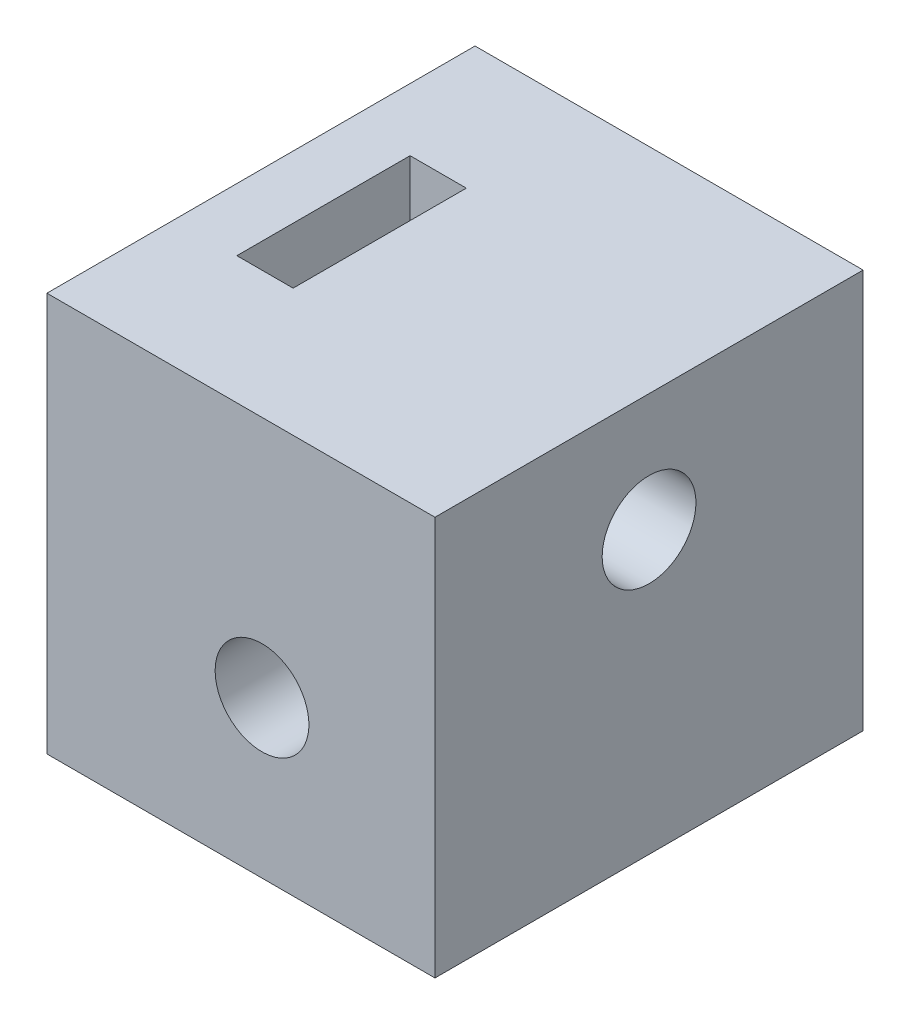
ISO-10303-21;
HEADER;
FILE_DESCRIPTION(('STEP AP214'),'2;1');
FILE_NAME('part.step','',(''),(''),'','','');
FILE_SCHEMA(('AUTOMOTIVE_DESIGN { 1 0 10303 214 1 1 1 1 }'));
ENDSEC;
DATA;
#1=APPLICATION_CONTEXT('core data for automotive mechanical design processes');
#2=APPLICATION_PROTOCOL_DEFINITION('international standard','automotive_design',2000,#1);
#3=PRODUCT_CONTEXT('',#1,'mechanical');
#4=PRODUCT('Part','Part','',(#3));
#5=PRODUCT_RELATED_PRODUCT_CATEGORY('part','',(#4));
#6=PRODUCT_DEFINITION_FORMATION('','',#4);
#7=PRODUCT_DEFINITION_CONTEXT('part definition',#1,'design');
#8=PRODUCT_DEFINITION('design','',#6,#7);
#9=PRODUCT_DEFINITION_SHAPE('','',#8);
#10=(LENGTH_UNIT() NAMED_UNIT(*) SI_UNIT(.MILLI.,.METRE.));
#11=(NAMED_UNIT(*) PLANE_ANGLE_UNIT() SI_UNIT($,.RADIAN.));
#12=(NAMED_UNIT(*) SI_UNIT($,.STERADIAN.) SOLID_ANGLE_UNIT());
#13=UNCERTAINTY_MEASURE_WITH_UNIT(LENGTH_MEASURE(1.E-05),#10,'distance_accuracy_value','');
#14=(GEOMETRIC_REPRESENTATION_CONTEXT(3) GLOBAL_UNCERTAINTY_ASSIGNED_CONTEXT((#13)) GLOBAL_UNIT_ASSIGNED_CONTEXT((#10,
#11,#12)) REPRESENTATION_CONTEXT('',''));
#15=CARTESIAN_POINT('',(0.,0.,0.));
#16=DIRECTION('',(0.,0.,1.));
#17=DIRECTION('',(1.,0.,0.));
#18=AXIS2_PLACEMENT_3D('',#15,#16,#17);
#19=CARTESIAN_POINT('',(7.00000000000103,8.99999999999991,6.85));
#20=DIRECTION('',(-1.,0.,0.));
#21=DIRECTION('',(0.,0.,1.));
#22=AXIS2_PLACEMENT_3D('',#19,#20,#21);
#23=CYLINDRICAL_SURFACE('',#22,1.5);
#24=CARTESIAN_POINT('',(-5.4176325201907,8.99999999999991,6.85));
#25=DIRECTION('',(-1.,0.,0.));
#26=DIRECTION('',(0.,0.,1.));
#27=AXIS2_PLACEMENT_3D('',#24,#25,#26);
#28=CIRCLE('',#27,1.5);
#29=CARTESIAN_POINT('',(-5.4176325201907,8.99999999999991,8.35));
#30=VERTEX_POINT('',#29);
#31=EDGE_CURVE('E201',#30,#30,#28,.T.);
#32=ORIENTED_EDGE('',*,*,#31,.T.);
#33=EDGE_LOOP('',(#32));
#34=FACE_BOUND('',#33,.T.);
#35=CARTESIAN_POINT('',(-3.4176325201907,8.99999999999991,6.85));
#36=DIRECTION('',(1.,0.,0.));
#37=DIRECTION('',(0.,1.,0.));
#38=AXIS2_PLACEMENT_3D('',#35,#36,#37);
#39=CIRCLE('',#38,1.5);
#40=CARTESIAN_POINT('',(-3.4176325201907,10.4999999999999,6.85));
#41=VERTEX_POINT('',#40);
#42=EDGE_CURVE('E196',#41,#41,#39,.F.);
#43=ORIENTED_EDGE('',*,*,#42,.F.);
#44=EDGE_LOOP('',(#43));
#45=FACE_BOUND('',#44,.T.);
#46=ADVANCED_FACE('F35',(#34,#45),#23,.F.);
#47=CARTESIAN_POINT('',(7.00000000000103,5.70584955722062E-13,13.7));
#48=DIRECTION('',(-1.,0.,0.));
#49=DIRECTION('',(0.,-1.,0.));
#50=AXIS2_PLACEMENT_3D('',#47,#48,#49);
#51=PLANE('',#50);
#52=CARTESIAN_POINT('',(7.00000000000103,8.99999999999991,6.85));
#53=DIRECTION('',(-1.,0.,0.));
#54=DIRECTION('',(0.,0.,1.));
#55=AXIS2_PLACEMENT_3D('',#52,#53,#54);
#56=CIRCLE('',#55,1.5);
#57=CARTESIAN_POINT('',(7.00000000000103,8.99999999999991,8.35));
#58=VERTEX_POINT('',#57);
#59=EDGE_CURVE('E197',#58,#58,#56,.T.);
#60=ORIENTED_EDGE('',*,*,#59,.T.);
#61=EDGE_LOOP('',(#60));
#62=FACE_BOUND('',#61,.T.);
#63=DIRECTION('',(0.,1.,0.));
#64=VECTOR('',#63,1.);
#65=CARTESIAN_POINT('',(7.00000000000103,5.70584955722062E-13,0.));
#66=LINE('',#65,#64);
#67=CARTESIAN_POINT('',(7.00000000000103,-8.20732370954123E-13,0.));
#68=VERTEX_POINT('',#67);
#69=CARTESIAN_POINT('',(6.99999999999999,12.7690688757875,0.));
#70=VERTEX_POINT('',#69);
#71=EDGE_CURVE('E220',#68,#70,#66,.T.);
#72=ORIENTED_EDGE('',*,*,#71,.T.);
#73=DIRECTION('',(0.,0.,-1.));
#74=VECTOR('',#73,1.);
#75=CARTESIAN_POINT('',(6.99999999999999,12.7690688757875,13.7));
#76=LINE('',#75,#74);
#77=CARTESIAN_POINT('',(6.99999999999999,12.7690688757875,13.7));
#78=VERTEX_POINT('',#77);
#79=EDGE_CURVE('E11',#78,#70,#76,.T.);
#80=ORIENTED_EDGE('',*,*,#79,.F.);
#81=DIRECTION('',(0.,1.,0.));
#82=VECTOR('',#81,1.);
#83=CARTESIAN_POINT('',(7.00000000000103,5.70584955722062E-13,13.7));
#84=LINE('',#83,#82);
#85=CARTESIAN_POINT('',(7.00000000000103,-8.20732370954123E-13,13.7));
#86=VERTEX_POINT('',#85);
#87=EDGE_CURVE('E207',#86,#78,#84,.T.);
#88=ORIENTED_EDGE('',*,*,#87,.F.);
#89=DIRECTION('',(0.,0.,-1.));
#90=VECTOR('',#89,1.);
#91=CARTESIAN_POINT('',(7.00000000000103,-8.20732370954123E-13,13.7));
#92=LINE('',#91,#90);
#93=EDGE_CURVE('E217',#86,#68,#92,.T.);
#94=ORIENTED_EDGE('',*,*,#93,.T.);
#95=EDGE_LOOP('',(#72,#80,#88,#94));
#96=FACE_BOUND('',#95,.T.);
#97=ADVANCED_FACE('F277',(#62,#96),#51,.F.);
#98=CARTESIAN_POINT('',(0.,12.7690688757876,13.7));
#99=DIRECTION('',(0.,-1.,0.));
#100=DIRECTION('',(1.,0.,0.));
#101=AXIS2_PLACEMENT_3D('',#98,#99,#100);
#102=PLANE('',#101);
#103=DIRECTION('',(0.,0.,1.));
#104=VECTOR('',#103,1.);
#105=CARTESIAN_POINT('',(-3.4176325201907,12.7690688757876,4.0787187078898));
#106=LINE('',#105,#104);
#107=CARTESIAN_POINT('',(-3.4176325201907,12.7690688757876,4.07871870788979));
#108=VERTEX_POINT('',#107);
#109=CARTESIAN_POINT('',(-3.4176325201907,12.7690688757876,9.6212812921102));
#110=VERTEX_POINT('',#109);
#111=EDGE_CURVE('E159',#108,#110,#106,.T.);
#112=ORIENTED_EDGE('',*,*,#111,.F.);
#113=DIRECTION('',(-1.,0.,0.));
#114=VECTOR('',#113,1.);
#115=CARTESIAN_POINT('',(-1.6176325201907,12.7690688757876,4.0787187078898));
#116=LINE('',#115,#114);
#117=CARTESIAN_POINT('',(-1.6176325201907,12.7690688757876,4.0787187078898));
#118=VERTEX_POINT('',#117);
#119=EDGE_CURVE('E60',#118,#108,#116,.T.);
#120=ORIENTED_EDGE('',*,*,#119,.F.);
#121=DIRECTION('',(0.,0.,-1.));
#122=VECTOR('',#121,1.);
#123=CARTESIAN_POINT('',(-1.6176325201907,12.7690688757876,9.6212812921102));
#124=LINE('',#123,#122);
#125=CARTESIAN_POINT('',(-1.6176325201907,12.7690688757876,9.6212812921102));
#126=VERTEX_POINT('',#125);
#127=EDGE_CURVE('E165',#126,#118,#124,.T.);
#128=ORIENTED_EDGE('',*,*,#127,.F.);
#129=DIRECTION('',(1.,0.,0.));
#130=VECTOR('',#129,1.);
#131=CARTESIAN_POINT('',(-3.4176325201907,12.7690688757876,9.6212812921102));
#132=LINE('',#131,#130);
#133=EDGE_CURVE('E162',#110,#126,#132,.T.);
#134=ORIENTED_EDGE('',*,*,#133,.F.);
#135=EDGE_LOOP('',(#112,#120,#128,#134));
#136=FACE_BOUND('',#135,.T.);
#137=DIRECTION('',(-1.,0.,0.));
#138=VECTOR('',#137,1.);
#139=CARTESIAN_POINT('',(0.,12.7690688757876,0.));
#140=LINE('',#139,#138);
#141=CARTESIAN_POINT('',(-5.4176325201907,12.7690688757867,0.));
#142=VERTEX_POINT('',#141);
#143=EDGE_CURVE('E223',#70,#142,#140,.T.);
#144=ORIENTED_EDGE('',*,*,#143,.T.);
#145=DIRECTION('',(0.,0.,-1.));
#146=VECTOR('',#145,1.);
#147=CARTESIAN_POINT('',(-5.4176325201907,12.7690688757867,13.7));
#148=LINE('',#147,#146);
#149=CARTESIAN_POINT('',(-5.4176325201907,12.7690688757867,13.7));
#150=VERTEX_POINT('',#149);
#151=EDGE_CURVE('E44',#150,#142,#148,.T.);
#152=ORIENTED_EDGE('',*,*,#151,.F.);
#153=DIRECTION('',(-1.,0.,0.));
#154=VECTOR('',#153,1.);
#155=CARTESIAN_POINT('',(0.,12.7690688757876,13.7));
#156=LINE('',#155,#154);
#157=EDGE_CURVE('E211',#78,#150,#156,.T.);
#158=ORIENTED_EDGE('',*,*,#157,.F.);
#159=ORIENTED_EDGE('',*,*,#79,.T.);
#160=EDGE_LOOP('',(#144,#152,#158,#159));
#161=FACE_BOUND('',#160,.T.);
#162=ADVANCED_FACE('F259',(#136,#161),#102,.F.);
#163=CARTESIAN_POINT('',(-5.4176325201907,0.,13.7));
#164=DIRECTION('',(1.,0.,0.));
#165=DIRECTION('',(0.,1.,0.));
#166=AXIS2_PLACEMENT_3D('',#163,#164,#165);
#167=PLANE('',#166);
#168=ORIENTED_EDGE('',*,*,#31,.F.);
#169=EDGE_LOOP('',(#168));
#170=FACE_BOUND('',#169,.T.);
#171=DIRECTION('',(0.,-1.,0.));
#172=VECTOR('',#171,1.);
#173=CARTESIAN_POINT('',(-5.4176325201907,0.,0.));
#174=LINE('',#173,#172);
#175=CARTESIAN_POINT('',(-5.4176325201907,-8.20732368313988E-13,0.));
#176=VERTEX_POINT('',#175);
#177=EDGE_CURVE('E225',#142,#176,#174,.T.);
#178=ORIENTED_EDGE('',*,*,#177,.T.);
#179=DIRECTION('',(0.,0.,-1.));
#180=VECTOR('',#179,1.);
#181=CARTESIAN_POINT('',(-5.4176325201907,-8.20732368313988E-13,13.7));
#182=LINE('',#181,#180);
#183=CARTESIAN_POINT('',(-5.4176325201907,-8.20732368313988E-13,13.7));
#184=VERTEX_POINT('',#183);
#185=EDGE_CURVE('E230',#184,#176,#182,.T.);
#186=ORIENTED_EDGE('',*,*,#185,.F.);
#187=DIRECTION('',(0.,-1.,0.));
#188=VECTOR('',#187,1.);
#189=CARTESIAN_POINT('',(-5.4176325201907,0.,13.7));
#190=LINE('',#189,#188);
#191=EDGE_CURVE('E213',#150,#184,#190,.T.);
#192=ORIENTED_EDGE('',*,*,#191,.F.);
#193=ORIENTED_EDGE('',*,*,#151,.T.);
#194=EDGE_LOOP('',(#178,#186,#192,#193));
#195=FACE_BOUND('',#194,.T.);
#196=ADVANCED_FACE('F302',(#170,#195),#167,.F.);
#197=CARTESIAN_POINT('',(1.46553756273603,4.99999999999991,13.7));
#198=DIRECTION('',(0.,0.,-1.));
#199=DIRECTION('',(-1.,0.,0.));
#200=AXIS2_PLACEMENT_3D('',#197,#198,#199);
#201=CYLINDRICAL_SURFACE('',#200,1.5);
#202=CARTESIAN_POINT('',(1.46553756273603,4.99999999999991,13.7));
#203=DIRECTION('',(0.,0.,1.));
#204=DIRECTION('',(1.,0.,0.));
#205=AXIS2_PLACEMENT_3D('',#202,#203,#204);
#206=CIRCLE('',#205,1.5);
#207=CARTESIAN_POINT('',(-0.0344624372639701,4.99999999999991,13.7));
#208=VERTEX_POINT('',#207);
#209=EDGE_CURVE('E204',#208,#208,#206,.T.);
#210=CARTESIAN_POINT('',(1.46553756273603,4.99999999999991,0.));
#211=DIRECTION('',(0.,0.,1.));
#212=DIRECTION('',(1.,0.,0.));
#213=AXIS2_PLACEMENT_3D('',#210,#211,#212);
#214=CIRCLE('',#213,1.5);
#215=CARTESIAN_POINT('',(-0.0344624372639701,4.99999999999991,0.));
#216=VERTEX_POINT('',#215);
#217=EDGE_CURVE('E200',#216,#216,#214,.T.);
#218=CARTESIAN_POINT('',(-0.0344624372639701,4.99999999999991,13.7));
#219=CARTESIAN_POINT('',(-0.0344624372639701,4.99999999999991,13.5572916666667));
#220=CARTESIAN_POINT('',(-0.0344624372639701,4.99999999999991,13.4145833333333));
#221=CARTESIAN_POINT('',(-0.0344624372639701,4.99999999999991,13.1291666666667));
#222=CARTESIAN_POINT('',(-0.0344624372639701,4.99999999999991,12.9864583333333));
#223=CARTESIAN_POINT('',(-0.0344624372639701,4.99999999999991,12.7010416666667));
#224=CARTESIAN_POINT('',(-0.0344624372639701,4.99999999999991,12.5583333333333));
#225=CARTESIAN_POINT('',(-0.0344624372639701,4.99999999999991,12.2729166666667));
#226=CARTESIAN_POINT('',(-0.0344624372639701,4.99999999999991,12.1302083333333));
#227=CARTESIAN_POINT('',(-0.0344624372639701,4.99999999999991,11.8447916666667));
#228=CARTESIAN_POINT('',(-0.0344624372639701,4.99999999999991,11.7020833333333));
#229=CARTESIAN_POINT('',(-0.0344624372639701,4.99999999999991,11.4166666666667));
#230=CARTESIAN_POINT('',(-0.0344624372639701,4.99999999999991,11.2739583333333));
#231=CARTESIAN_POINT('',(-0.0344624372639701,4.99999999999991,10.9885416666667));
#232=CARTESIAN_POINT('',(-0.0344624372639701,4.99999999999991,10.8458333333333));
#233=CARTESIAN_POINT('',(-0.0344624372639701,4.99999999999991,10.5604166666667));
#234=CARTESIAN_POINT('',(-0.0344624372639701,4.99999999999991,10.4177083333333));
#235=CARTESIAN_POINT('',(-0.0344624372639701,4.99999999999991,10.1322916666667));
#236=CARTESIAN_POINT('',(-0.0344624372639701,4.99999999999991,9.98958333333333));
#237=CARTESIAN_POINT('',(-0.0344624372639701,4.99999999999991,9.70416666666666));
#238=CARTESIAN_POINT('',(-0.0344624372639701,4.99999999999991,9.56145833333333));
#239=CARTESIAN_POINT('',(-0.0344624372639701,4.99999999999991,9.27604166666666));
#240=CARTESIAN_POINT('',(-0.0344624372639701,4.99999999999991,9.13333333333333));
#241=CARTESIAN_POINT('',(-0.0344624372639701,4.99999999999991,8.84791666666666));
#242=CARTESIAN_POINT('',(-0.0344624372639701,4.99999999999991,8.70520833333333));
#243=CARTESIAN_POINT('',(-0.0344624372639701,4.99999999999991,8.41979166666667));
#244=CARTESIAN_POINT('',(-0.0344624372639701,4.99999999999991,8.27708333333333));
#245=CARTESIAN_POINT('',(-0.0344624372639701,4.99999999999991,7.99166666666667));
#246=CARTESIAN_POINT('',(-0.0344624372639701,4.99999999999991,7.84895833333333));
#247=CARTESIAN_POINT('',(-0.0344624372639701,4.99999999999991,7.56354166666667));
#248=CARTESIAN_POINT('',(-0.0344624372639701,4.99999999999991,7.42083333333333));
#249=CARTESIAN_POINT('',(-0.0344624372639701,4.99999999999991,7.13541666666667));
#250=CARTESIAN_POINT('',(-0.0344624372639701,4.99999999999991,6.99270833333333));
#251=CARTESIAN_POINT('',(-0.0344624372639701,4.99999999999991,6.70729166666667));
#252=CARTESIAN_POINT('',(-0.0344624372639701,4.99999999999991,6.56458333333333));
#253=CARTESIAN_POINT('',(-0.0344624372639701,4.99999999999991,6.27916666666667));
#254=CARTESIAN_POINT('',(-0.0344624372639701,4.99999999999991,6.13645833333333));
#255=CARTESIAN_POINT('',(-0.0344624372639701,4.99999999999991,5.85104166666667));
#256=CARTESIAN_POINT('',(-0.0344624372639701,4.99999999999991,5.70833333333333));
#257=CARTESIAN_POINT('',(-0.0344624372639701,4.99999999999991,5.42291666666667));
#258=CARTESIAN_POINT('',(-0.0344624372639701,4.99999999999991,5.28020833333333));
#259=CARTESIAN_POINT('',(-0.0344624372639701,4.99999999999991,4.99479166666667));
#260=CARTESIAN_POINT('',(-0.0344624372639701,4.99999999999991,4.85208333333333));
#261=CARTESIAN_POINT('',(-0.0344624372639701,4.99999999999991,4.56666666666667));
#262=CARTESIAN_POINT('',(-0.0344624372639701,4.99999999999991,4.42395833333333));
#263=CARTESIAN_POINT('',(-0.0344624372639701,4.99999999999991,4.13854166666667));
#264=CARTESIAN_POINT('',(-0.0344624372639701,4.99999999999991,3.99583333333333));
#265=CARTESIAN_POINT('',(-0.0344624372639701,4.99999999999991,3.71041666666667));
#266=CARTESIAN_POINT('',(-0.0344624372639701,4.99999999999991,3.56770833333333));
#267=CARTESIAN_POINT('',(-0.0344624372639701,4.99999999999991,3.28229166666667));
#268=CARTESIAN_POINT('',(-0.0344624372639701,4.99999999999991,3.13958333333333));
#269=CARTESIAN_POINT('',(-0.0344624372639701,4.99999999999991,2.85416666666667));
#270=CARTESIAN_POINT('',(-0.0344624372639701,4.99999999999991,2.71145833333333));
#271=CARTESIAN_POINT('',(-0.0344624372639701,4.99999999999991,2.42604166666667));
#272=CARTESIAN_POINT('',(-0.0344624372639701,4.99999999999991,2.28333333333333));
#273=CARTESIAN_POINT('',(-0.0344624372639701,4.99999999999991,1.99791666666667));
#274=CARTESIAN_POINT('',(-0.0344624372639701,4.99999999999991,1.85520833333333));
#275=CARTESIAN_POINT('',(-0.0344624372639701,4.99999999999991,1.56979166666667));
#276=CARTESIAN_POINT('',(-0.0344624372639701,4.99999999999991,1.42708333333333));
#277=CARTESIAN_POINT('',(-0.0344624372639701,4.99999999999991,1.14166666666667));
#278=CARTESIAN_POINT('',(-0.0344624372639701,4.99999999999991,0.998958333333333));
#279=CARTESIAN_POINT('',(-0.0344624372639701,4.99999999999991,0.713541666666666));
#280=CARTESIAN_POINT('',(-0.0344624372639701,4.99999999999991,0.570833333333333));
#281=CARTESIAN_POINT('',(-0.0344624372639701,4.99999999999991,0.285416666666666));
#282=CARTESIAN_POINT('',(-0.0344624372639701,4.99999999999991,0.142708333333333));
#283=CARTESIAN_POINT('',(-0.0344624372639701,4.99999999999991,0.));
#284=B_SPLINE_CURVE_WITH_KNOTS('',3,(#218,#219,#220,#221,#222,#223,#224,#225,#226,#227,#228,
#229,#230,#231,#232,#233,#234,#235,#236,#237,#238,#239,#240,#241,#242,#243,#244,#245,#246,#247,
#248,#249,#250,#251,#252,#253,#254,#255,#256,#257,#258,#259,#260,#261,#262,#263,#264,#265,#266,
#267,#268,#269,#270,#271,#272,#273,#274,#275,#276,#277,#278,#279,#280,#281,#282,#283),
.UNSPECIFIED.,.F.,.F.,(4,2,2,2,2,2,2,2,2,2,2,2,2,2,2,2,2,2,2,2,2,2,2,2,2,2,2,2,2,2,2,2,4),(0.,
0.428125000000001,0.856250000000001,1.284375,1.7125,2.140625,2.56875,2.996875,3.425,3.853125,
4.28125,4.709375,5.1375,5.565625,5.99375,6.421875,6.85,7.278125,7.70625,8.134375,8.5625,
8.990625,9.41875,9.846875,10.275,10.703125,11.13125,11.559375,11.9875,12.415625,12.84375,
13.271875,13.7),.UNSPECIFIED.);
#285=EDGE_CURVE('BSEAM37',#208,#216,#284,.T.);
#286=ORIENTED_EDGE('',*,*,#209,.T.);
#287=ORIENTED_EDGE('',*,*,#217,.F.);
#288=ORIENTED_EDGE('',*,*,#285,.T.);
#289=ORIENTED_EDGE('',*,*,#285,.F.);
#290=EDGE_LOOP('',(#286,#288,#287,#289));
#291=FACE_BOUND('',#290,.T.);
#292=ADVANCED_FACE('F37',(#291),#201,.F.);
#293=CARTESIAN_POINT('',(0.,-8.20732370954133E-13,13.7));
#294=DIRECTION('',(0.,1.,0.));
#295=DIRECTION('',(-1.,0.,0.));
#296=AXIS2_PLACEMENT_3D('',#293,#294,#295);
#297=PLANE('',#296);
#298=DIRECTION('',(-1.,0.,0.));
#299=VECTOR('',#298,1.);
#300=CARTESIAN_POINT('',(-3.4176325201907,-8.22258927613007E-13,5.4643593539449));
#301=LINE('',#300,#299);
#302=CARTESIAN_POINT('',(-1.6176325201907,-8.21391565875018E-13,5.4643593539449));
#303=VERTEX_POINT('',#302);
#304=CARTESIAN_POINT('',(-3.4176325201907,-8.22258927613007E-13,5.4643593539449));
#305=VERTEX_POINT('',#304);
#306=EDGE_CURVE('E139',#303,#305,#301,.T.);
#307=ORIENTED_EDGE('',*,*,#306,.T.);
#308=DIRECTION('',(0.,0.,1.));
#309=VECTOR('',#308,1.);
#310=CARTESIAN_POINT('',(-3.4176325201907,-8.22258927613007E-13,5.4643593539449));
#311=LINE('',#310,#309);
#312=CARTESIAN_POINT('',(-3.4176325201907,-8.22258927613007E-13,8.2356406460551));
#313=VERTEX_POINT('',#312);
#314=EDGE_CURVE('E131',#305,#313,#311,.T.);
#315=ORIENTED_EDGE('',*,*,#314,.T.);
#316=DIRECTION('',(1.,0.,0.));
#317=VECTOR('',#316,1.);
#318=CARTESIAN_POINT('',(-3.4176325201907,-8.22258927613007E-13,8.2356406460551));
#319=LINE('',#318,#317);
#320=CARTESIAN_POINT('',(-1.6176325201907,-8.20732370954136E-13,8.2356406460551));
#321=VERTEX_POINT('',#320);
#322=EDGE_CURVE('E142',#313,#321,#319,.T.);
#323=ORIENTED_EDGE('',*,*,#322,.T.);
#324=DIRECTION('',(0.,0.,-1.));
#325=VECTOR('',#324,1.);
#326=CARTESIAN_POINT('',(-1.6176325201907,-8.21391565875018E-13,5.4643593539449));
#327=LINE('',#326,#325);
#328=EDGE_CURVE('E52',#321,#303,#327,.T.);
#329=ORIENTED_EDGE('',*,*,#328,.T.);
#330=EDGE_LOOP('',(#307,#315,#323,#329));
#331=FACE_BOUND('',#330,.T.);
#332=DIRECTION('',(1.,0.,0.));
#333=VECTOR('',#332,1.);
#334=CARTESIAN_POINT('',(0.,-8.20732370954133E-13,0.));
#335=LINE('',#334,#333);
#336=EDGE_CURVE('E208',#176,#68,#335,.T.);
#337=ORIENTED_EDGE('',*,*,#336,.T.);
#338=ORIENTED_EDGE('',*,*,#93,.F.);
#339=DIRECTION('',(1.,0.,0.));
#340=VECTOR('',#339,1.);
#341=CARTESIAN_POINT('',(0.,-8.20732370954133E-13,13.7));
#342=LINE('',#341,#340);
#343=EDGE_CURVE('E215',#184,#86,#342,.T.);
#344=ORIENTED_EDGE('',*,*,#343,.F.);
#345=ORIENTED_EDGE('',*,*,#185,.T.);
#346=EDGE_LOOP('',(#337,#338,#344,#345));
#347=FACE_BOUND('',#346,.T.);
#348=ADVANCED_FACE('F146',(#331,#347),#297,.F.);
#349=CARTESIAN_POINT('',(0.,0.,13.7));
#350=DIRECTION('',(0.,0.,1.));
#351=DIRECTION('',(1.,0.,0.));
#352=AXIS2_PLACEMENT_3D('',#349,#350,#351);
#353=PLANE('',#352);
#354=ORIENTED_EDGE('',*,*,#209,.F.);
#355=EDGE_LOOP('',(#354));
#356=FACE_BOUND('',#355,.T.);
#357=ORIENTED_EDGE('',*,*,#87,.T.);
#358=ORIENTED_EDGE('',*,*,#157,.T.);
#359=ORIENTED_EDGE('',*,*,#191,.T.);
#360=ORIENTED_EDGE('',*,*,#343,.T.);
#361=EDGE_LOOP('',(#357,#358,#359,#360));
#362=FACE_BOUND('',#361,.T.);
#363=ADVANCED_FACE('F291',(#356,#362),#353,.T.);
#364=CARTESIAN_POINT('',(0.,0.,0.));
#365=DIRECTION('',(0.,0.,1.));
#366=DIRECTION('',(1.,0.,0.));
#367=AXIS2_PLACEMENT_3D('',#364,#365,#366);
#368=PLANE('',#367);
#369=ORIENTED_EDGE('',*,*,#217,.T.);
#370=EDGE_LOOP('',(#369));
#371=FACE_BOUND('',#370,.T.);
#372=ORIENTED_EDGE('',*,*,#71,.F.);
#373=ORIENTED_EDGE('',*,*,#336,.F.);
#374=ORIENTED_EDGE('',*,*,#177,.F.);
#375=ORIENTED_EDGE('',*,*,#143,.F.);
#376=EDGE_LOOP('',(#372,#373,#374,#375));
#377=FACE_BOUND('',#376,.T.);
#378=ADVANCED_FACE('F287',(#371,#377),#368,.F.);
#379=CARTESIAN_POINT('',(-1.6176325201907,8.99999999999991,6.85));
#380=DIRECTION('',(1.,0.,0.));
#381=DIRECTION('',(0.,1.,0.));
#382=AXIS2_PLACEMENT_3D('',#379,#380,#381);
#383=CIRCLE('',#382,1.5);
#384=CARTESIAN_POINT('',(-1.6176325201907,10.4999999999999,6.85));
#385=VERTEX_POINT('',#384);
#386=EDGE_CURVE('E39',#385,#385,#383,.F.);
#387=ORIENTED_EDGE('',*,*,#386,.T.);
#388=EDGE_LOOP('',(#387));
#389=FACE_BOUND('',#388,.T.);
#390=ORIENTED_EDGE('',*,*,#59,.F.);
#391=EDGE_LOOP('',(#390));
#392=FACE_BOUND('',#391,.T.);
#393=ADVANCED_FACE('F240',(#389,#392),#23,.F.);
#394=CARTESIAN_POINT('',(-1.6176325201907,0.,0.));
#395=DIRECTION('',(1.,0.,0.));
#396=DIRECTION('',(0.,1.,0.));
#397=AXIS2_PLACEMENT_3D('',#394,#395,#396);
#398=PLANE('',#397);
#399=ORIENTED_EDGE('',*,*,#386,.F.);
#400=EDGE_LOOP('',(#399));
#401=FACE_BOUND('',#400,.T.);
#402=DIRECTION('',(0.,1.,0.));
#403=VECTOR('',#402,1.);
#404=CARTESIAN_POINT('',(-1.6176325201907,8.9999999999999,4.0787187078898));
#405=LINE('',#404,#403);
#406=CARTESIAN_POINT('',(-1.6176325201907,8.9999999999999,4.0787187078898));
#407=VERTEX_POINT('',#406);
#408=EDGE_CURVE('E169',#407,#118,#405,.T.);
#409=ORIENTED_EDGE('',*,*,#408,.F.);
#410=DIRECTION('',(0.,0.866025403784439,-0.5));
#411=VECTOR('',#410,1.);
#412=CARTESIAN_POINT('',(-1.6176325201907,6.5999999999999,5.4643593539449));
#413=LINE('',#412,#411);
#414=CARTESIAN_POINT('',(-1.6176325201907,6.5999999999999,5.4643593539449));
#415=VERTEX_POINT('',#414);
#416=EDGE_CURVE('E177',#415,#407,#413,.T.);
#417=ORIENTED_EDGE('',*,*,#416,.F.);
#418=DIRECTION('',(0.,1.,0.));
#419=VECTOR('',#418,1.);
#420=CARTESIAN_POINT('',(-1.6176325201907,-8.21391565875018E-13,5.4643593539449));
#421=LINE('',#420,#419);
#422=EDGE_CURVE('E155',#303,#415,#421,.T.);
#423=ORIENTED_EDGE('',*,*,#422,.F.);
#424=ORIENTED_EDGE('',*,*,#328,.F.);
#425=DIRECTION('',(0.,1.,0.));
#426=VECTOR('',#425,1.);
#427=CARTESIAN_POINT('',(-1.6176325201907,-8.21391565875018E-13,8.2356406460551));
#428=LINE('',#427,#426);
#429=CARTESIAN_POINT('',(-1.6176325201907,6.5999999999999,8.2356406460551));
#430=VERTEX_POINT('',#429);
#431=EDGE_CURVE('E138',#321,#430,#428,.T.);
#432=ORIENTED_EDGE('',*,*,#431,.T.);
#433=DIRECTION('',(0.,-0.866025403784439,-0.5));
#434=VECTOR('',#433,1.);
#435=CARTESIAN_POINT('',(-1.6176325201907,8.99999999999991,9.6212812921102));
#436=LINE('',#435,#434);
#437=CARTESIAN_POINT('',(-1.6176325201907,8.99999999999991,9.6212812921102));
#438=VERTEX_POINT('',#437);
#439=EDGE_CURVE('E180',#438,#430,#436,.T.);
#440=ORIENTED_EDGE('',*,*,#439,.F.);
#441=DIRECTION('',(0.,1.,0.));
#442=VECTOR('',#441,1.);
#443=CARTESIAN_POINT('',(-1.6176325201907,8.9999999999999,9.6212812921102));
#444=LINE('',#443,#442);
#445=EDGE_CURVE('E172',#438,#126,#444,.T.);
#446=ORIENTED_EDGE('',*,*,#445,.T.);
#447=ORIENTED_EDGE('',*,*,#127,.T.);
#448=EDGE_LOOP('',(#409,#417,#423,#424,#432,#440,#446,#447));
#449=FACE_BOUND('',#448,.T.);
#450=ADVANCED_FACE('F243',(#401,#449),#398,.F.);
#451=CARTESIAN_POINT('',(-3.4176325201907,0.,0.));
#452=DIRECTION('',(1.,0.,0.));
#453=DIRECTION('',(0.,1.,0.));
#454=AXIS2_PLACEMENT_3D('',#451,#452,#453);
#455=PLANE('',#454);
#456=ORIENTED_EDGE('',*,*,#42,.T.);
#457=EDGE_LOOP('',(#456));
#458=FACE_BOUND('',#457,.T.);
#459=DIRECTION('',(0.,0.866025403784439,-0.5));
#460=VECTOR('',#459,1.);
#461=CARTESIAN_POINT('',(-3.4176325201907,6.5999999999999,5.4643593539449));
#462=LINE('',#461,#460);
#463=CARTESIAN_POINT('',(-3.4176325201907,6.5999999999999,5.4643593539449));
#464=VERTEX_POINT('',#463);
#465=CARTESIAN_POINT('',(-3.4176325201907,8.9999999999999,4.0787187078898));
#466=VERTEX_POINT('',#465);
#467=EDGE_CURVE('E171',#464,#466,#462,.T.);
#468=ORIENTED_EDGE('',*,*,#467,.T.);
#469=DIRECTION('',(0.,1.,0.));
#470=VECTOR('',#469,1.);
#471=CARTESIAN_POINT('',(-3.4176325201907,8.9999999999999,4.0787187078898));
#472=LINE('',#471,#470);
#473=EDGE_CURVE('E168',#466,#108,#472,.T.);
#474=ORIENTED_EDGE('',*,*,#473,.T.);
#475=ORIENTED_EDGE('',*,*,#111,.T.);
#476=DIRECTION('',(0.,1.,0.));
#477=VECTOR('',#476,1.);
#478=CARTESIAN_POINT('',(-3.4176325201907,8.9999999999999,9.6212812921102));
#479=LINE('',#478,#477);
#480=CARTESIAN_POINT('',(-3.4176325201907,8.9999999999999,9.6212812921102));
#481=VERTEX_POINT('',#480);
#482=EDGE_CURVE('E174',#481,#110,#479,.T.);
#483=ORIENTED_EDGE('',*,*,#482,.F.);
#484=DIRECTION('',(0.,-0.866025403784439,-0.5));
#485=VECTOR('',#484,1.);
#486=CARTESIAN_POINT('',(-3.4176325201907,8.99999999999991,9.6212812921102));
#487=LINE('',#486,#485);
#488=CARTESIAN_POINT('',(-3.4176325201907,6.5999999999999,8.2356406460551));
#489=VERTEX_POINT('',#488);
#490=EDGE_CURVE('E134',#481,#489,#487,.T.);
#491=ORIENTED_EDGE('',*,*,#490,.T.);
#492=DIRECTION('',(0.,1.,0.));
#493=VECTOR('',#492,1.);
#494=CARTESIAN_POINT('',(-3.4176325201907,-8.22258927613007E-13,8.2356406460551));
#495=LINE('',#494,#493);
#496=EDGE_CURVE('E126',#313,#489,#495,.T.);
#497=ORIENTED_EDGE('',*,*,#496,.F.);
#498=ORIENTED_EDGE('',*,*,#314,.F.);
#499=DIRECTION('',(0.,1.,0.));
#500=VECTOR('',#499,1.);
#501=CARTESIAN_POINT('',(-3.4176325201907,-8.22258927613007E-13,5.4643593539449));
#502=LINE('',#501,#500);
#503=EDGE_CURVE('E153',#305,#464,#502,.T.);
#504=ORIENTED_EDGE('',*,*,#503,.T.);
#505=EDGE_LOOP('',(#468,#474,#475,#483,#491,#497,#498,#504));
#506=FACE_BOUND('',#505,.T.);
#507=ADVANCED_FACE('F129',(#458,#506),#455,.T.);
#508=CARTESIAN_POINT('',(-1.6176325201907,6.5999999999999,5.4643593539449));
#509=DIRECTION('',(0.,0.5,0.866025403784439));
#510=DIRECTION('',(0.,-0.866025403784439,0.5));
#511=AXIS2_PLACEMENT_3D('',#508,#509,#510);
#512=PLANE('',#511);
#513=ORIENTED_EDGE('',*,*,#467,.F.);
#514=DIRECTION('',(-1.,0.,0.));
#515=VECTOR('',#514,1.);
#516=CARTESIAN_POINT('',(-1.6176325201907,6.5999999999999,5.4643593539449));
#517=LINE('',#516,#515);
#518=EDGE_CURVE('E193',#415,#464,#517,.T.);
#519=ORIENTED_EDGE('',*,*,#518,.F.);
#520=ORIENTED_EDGE('',*,*,#416,.T.);
#521=DIRECTION('',(-1.,0.,0.));
#522=VECTOR('',#521,1.);
#523=CARTESIAN_POINT('',(-1.6176325201907,8.9999999999999,4.0787187078898));
#524=LINE('',#523,#522);
#525=EDGE_CURVE('E190',#407,#466,#524,.T.);
#526=ORIENTED_EDGE('',*,*,#525,.T.);
#527=EDGE_LOOP('',(#513,#519,#520,#526));
#528=FACE_BOUND('',#527,.T.);
#529=ADVANCED_FACE('F253',(#528),#512,.T.);
#530=CARTESIAN_POINT('',(-1.6176325201907,8.99999999999991,9.6212812921102));
#531=DIRECTION('',(0.,0.5,-0.866025403784439));
#532=DIRECTION('',(0.,0.866025403784439,0.5));
#533=AXIS2_PLACEMENT_3D('',#530,#531,#532);
#534=PLANE('',#533);
#535=ORIENTED_EDGE('',*,*,#490,.F.);
#536=DIRECTION('',(-1.,0.,0.));
#537=VECTOR('',#536,1.);
#538=CARTESIAN_POINT('',(-1.6176325201907,8.99999999999991,9.6212812921102));
#539=LINE('',#538,#537);
#540=EDGE_CURVE('E187',#438,#481,#539,.T.);
#541=ORIENTED_EDGE('',*,*,#540,.F.);
#542=ORIENTED_EDGE('',*,*,#439,.T.);
#543=DIRECTION('',(-1.,0.,0.));
#544=VECTOR('',#543,1.);
#545=CARTESIAN_POINT('',(-1.6176325201907,6.5999999999999,8.2356406460551));
#546=LINE('',#545,#544);
#547=EDGE_CURVE('E183',#430,#489,#546,.T.);
#548=ORIENTED_EDGE('',*,*,#547,.T.);
#549=EDGE_LOOP('',(#535,#541,#542,#548));
#550=FACE_BOUND('',#549,.T.);
#551=ADVANCED_FACE('F266',(#550),#534,.T.);
#552=CARTESIAN_POINT('',(-1.6176325201907,8.9999999999999,4.0787187078898));
#553=DIRECTION('',(0.,0.,-1.));
#554=DIRECTION('',(-1.,0.,0.));
#555=AXIS2_PLACEMENT_3D('',#552,#553,#554);
#556=PLANE('',#555);
#557=ORIENTED_EDGE('',*,*,#119,.T.);
#558=ORIENTED_EDGE('',*,*,#473,.F.);
#559=ORIENTED_EDGE('',*,*,#525,.F.);
#560=ORIENTED_EDGE('',*,*,#408,.T.);
#561=EDGE_LOOP('',(#557,#558,#559,#560));
#562=FACE_BOUND('',#561,.T.);
#563=ADVANCED_FACE('F250',(#562),#556,.F.);
#564=CARTESIAN_POINT('',(-3.4176325201907,8.9999999999999,9.6212812921102));
#565=DIRECTION('',(0.,0.,1.));
#566=DIRECTION('',(1.,0.,0.));
#567=AXIS2_PLACEMENT_3D('',#564,#565,#566);
#568=PLANE('',#567);
#569=ORIENTED_EDGE('',*,*,#133,.T.);
#570=ORIENTED_EDGE('',*,*,#445,.F.);
#571=ORIENTED_EDGE('',*,*,#540,.T.);
#572=ORIENTED_EDGE('',*,*,#482,.T.);
#573=EDGE_LOOP('',(#569,#570,#571,#572));
#574=FACE_BOUND('',#573,.T.);
#575=ADVANCED_FACE('F262',(#574),#568,.F.);
#576=CARTESIAN_POINT('',(-3.4176325201907,-8.22258927613007E-13,5.4643593539449));
#577=DIRECTION('',(0.,0.,-1.));
#578=DIRECTION('',(-1.,0.,0.));
#579=AXIS2_PLACEMENT_3D('',#576,#577,#578);
#580=PLANE('',#579);
#581=ORIENTED_EDGE('',*,*,#518,.T.);
#582=ORIENTED_EDGE('',*,*,#503,.F.);
#583=ORIENTED_EDGE('',*,*,#306,.F.);
#584=ORIENTED_EDGE('',*,*,#422,.T.);
#585=EDGE_LOOP('',(#581,#582,#583,#584));
#586=FACE_BOUND('',#585,.T.);
#587=ADVANCED_FACE('F255',(#586),#580,.F.);
#588=CARTESIAN_POINT('',(-3.4176325201907,-8.22258927613007E-13,8.2356406460551));
#589=DIRECTION('',(0.,0.,1.));
#590=DIRECTION('',(1.,0.,0.));
#591=AXIS2_PLACEMENT_3D('',#588,#589,#590);
#592=PLANE('',#591);
#593=ORIENTED_EDGE('',*,*,#547,.F.);
#594=ORIENTED_EDGE('',*,*,#431,.F.);
#595=ORIENTED_EDGE('',*,*,#322,.F.);
#596=ORIENTED_EDGE('',*,*,#496,.T.);
#597=EDGE_LOOP('',(#593,#594,#595,#596));
#598=FACE_BOUND('',#597,.T.);
#599=ADVANCED_FACE('F143',(#598),#592,.F.);
#600=CLOSED_SHELL('',(#46,#97,#162,#196,#292,#348,#363,#378,#393,#450,#507,#529,#551,#563,#575,
#587,#599));
#601=MANIFOLD_SOLID_BREP('B2',#600);
#602=ADVANCED_BREP_SHAPE_REPRESENTATION('',(#18,#601),#14);
#603=SHAPE_DEFINITION_REPRESENTATION(#9,#602);
ENDSEC;
END-ISO-10303-21;
